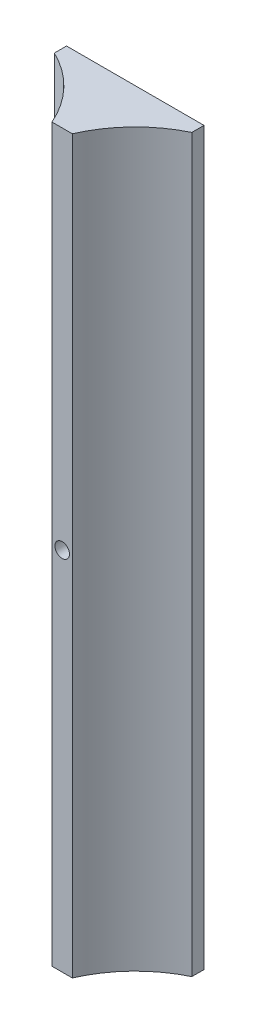
ISO-10303-21;
HEADER;
FILE_DESCRIPTION(('STEP AP214'),'2;1');
FILE_NAME('part.step','',(''),(''),'','','');
FILE_SCHEMA(('AUTOMOTIVE_DESIGN { 1 0 10303 214 1 1 1 1 }'));
ENDSEC;
DATA;
#1=APPLICATION_CONTEXT('core data for automotive mechanical design processes');
#2=APPLICATION_PROTOCOL_DEFINITION('international standard','automotive_design',2000,#1);
#3=PRODUCT_CONTEXT('',#1,'mechanical');
#4=PRODUCT('Part','Part','',(#3));
#5=PRODUCT_RELATED_PRODUCT_CATEGORY('part','',(#4));
#6=PRODUCT_DEFINITION_FORMATION('','',#4);
#7=PRODUCT_DEFINITION_CONTEXT('part definition',#1,'design');
#8=PRODUCT_DEFINITION('design','',#6,#7);
#9=PRODUCT_DEFINITION_SHAPE('','',#8);
#10=(LENGTH_UNIT() NAMED_UNIT(*) SI_UNIT(.MILLI.,.METRE.));
#11=(NAMED_UNIT(*) PLANE_ANGLE_UNIT() SI_UNIT($,.RADIAN.));
#12=(NAMED_UNIT(*) SI_UNIT($,.STERADIAN.) SOLID_ANGLE_UNIT());
#13=UNCERTAINTY_MEASURE_WITH_UNIT(LENGTH_MEASURE(1.E-05),#10,'distance_accuracy_value','');
#14=(GEOMETRIC_REPRESENTATION_CONTEXT(3) GLOBAL_UNCERTAINTY_ASSIGNED_CONTEXT((#13)) GLOBAL_UNIT_ASSIGNED_CONTEXT((#10,
#11,#12)) REPRESENTATION_CONTEXT('',''));
#15=CARTESIAN_POINT('',(0.,0.,0.));
#16=DIRECTION('',(0.,0.,1.));
#17=DIRECTION('',(1.,0.,0.));
#18=AXIS2_PLACEMENT_3D('',#15,#16,#17);
#19=CARTESIAN_POINT('',(-10.,60.,4.));
#20=DIRECTION('',(0.,-1.,0.));
#21=DIRECTION('',(0.,0.,-1.));
#22=AXIS2_PLACEMENT_3D('',#19,#20,#21);
#23=CYLINDRICAL_SURFACE('',#22,10.);
#24=CARTESIAN_POINT('',(-10.,0.,4.));
#25=DIRECTION('',(0.,-1.,0.));
#26=DIRECTION('',(0.,0.,-1.));
#27=AXIS2_PLACEMENT_3D('',#24,#25,#26);
#28=CIRCLE('',#27,10.);
#29=CARTESIAN_POINT('',(-5.64110105645933,0.,-5.));
#30=VERTEX_POINT('',#29);
#31=CARTESIAN_POINT('',(-0.83484861008832,0.,0.));
#32=VERTEX_POINT('',#31);
#33=EDGE_CURVE('E133',#30,#32,#28,.T.);
#34=ORIENTED_EDGE('',*,*,#33,.T.);
#35=DIRECTION('',(0.,-1.,0.));
#36=VECTOR('',#35,1.);
#37=CARTESIAN_POINT('',(-0.83484861008832,60.,0.));
#38=LINE('',#37,#36);
#39=CARTESIAN_POINT('',(-0.83484861008832,60.,0.));
#40=VERTEX_POINT('',#39);
#41=EDGE_CURVE('E11',#40,#32,#38,.T.);
#42=ORIENTED_EDGE('',*,*,#41,.F.);
#43=CARTESIAN_POINT('',(-10.,60.,4.));
#44=DIRECTION('',(0.,-1.,0.));
#45=DIRECTION('',(0.,0.,-1.));
#46=AXIS2_PLACEMENT_3D('',#43,#44,#45);
#47=CIRCLE('',#46,10.);
#48=CARTESIAN_POINT('',(-5.64110105645933,60.,-5.));
#49=VERTEX_POINT('',#48);
#50=EDGE_CURVE('E150',#49,#40,#47,.T.);
#51=ORIENTED_EDGE('',*,*,#50,.F.);
#52=DIRECTION('',(0.,-1.,0.));
#53=VECTOR('',#52,1.);
#54=CARTESIAN_POINT('',(-5.64110105645933,60.,-5.));
#55=LINE('',#54,#53);
#56=EDGE_CURVE('E129',#49,#30,#55,.T.);
#57=ORIENTED_EDGE('',*,*,#56,.T.);
#58=EDGE_LOOP('',(#34,#42,#51,#57));
#59=FACE_BOUND('',#58,.T.);
#60=ADVANCED_FACE('F43',(#59),#23,.F.);
#61=CARTESIAN_POINT('',(-0.83484861008832,60.,0.));
#62=DIRECTION('',(0.,0.,-1.));
#63=DIRECTION('',(-1.,0.,0.));
#64=AXIS2_PLACEMENT_3D('',#61,#62,#63);
#65=PLANE('',#64);
#66=CARTESIAN_POINT('',(0.,30.,0.));
#67=DIRECTION('',(0.,0.,-1.));
#68=DIRECTION('',(-1.,0.,0.));
#69=AXIS2_PLACEMENT_3D('',#66,#67,#68);
#70=CIRCLE('',#69,0.599999999999999);
#71=CARTESIAN_POINT('',(-0.599999999999999,30.,0.));
#72=VERTEX_POINT('',#71);
#73=EDGE_CURVE('E265',#72,#72,#70,.T.);
#74=ORIENTED_EDGE('',*,*,#73,.T.);
#75=EDGE_LOOP('',(#74));
#76=FACE_BOUND('',#75,.T.);
#77=DIRECTION('',(1.,0.,0.));
#78=VECTOR('',#77,1.);
#79=CARTESIAN_POINT('',(-0.83484861008832,0.,0.));
#80=LINE('',#79,#78);
#81=CARTESIAN_POINT('',(0.83484861008832,0.,0.));
#82=VERTEX_POINT('',#81);
#83=EDGE_CURVE('E137',#32,#82,#80,.T.);
#84=ORIENTED_EDGE('',*,*,#83,.T.);
#85=DIRECTION('',(0.,-1.,0.));
#86=VECTOR('',#85,1.);
#87=CARTESIAN_POINT('',(0.83484861008832,60.,0.));
#88=LINE('',#87,#86);
#89=CARTESIAN_POINT('',(0.83484861008832,60.,0.));
#90=VERTEX_POINT('',#89);
#91=EDGE_CURVE('E53',#90,#82,#88,.T.);
#92=ORIENTED_EDGE('',*,*,#91,.F.);
#93=DIRECTION('',(1.,0.,0.));
#94=VECTOR('',#93,1.);
#95=CARTESIAN_POINT('',(-0.83484861008832,60.,0.));
#96=LINE('',#95,#94);
#97=EDGE_CURVE('E98',#40,#90,#96,.T.);
#98=ORIENTED_EDGE('',*,*,#97,.F.);
#99=ORIENTED_EDGE('',*,*,#41,.T.);
#100=EDGE_LOOP('',(#84,#92,#98,#99));
#101=FACE_BOUND('',#100,.T.);
#102=ADVANCED_FACE('F180',(#76,#101),#65,.F.);
#103=CARTESIAN_POINT('',(10.,60.,4.));
#104=DIRECTION('',(0.,-1.,0.));
#105=DIRECTION('',(0.,0.,-1.));
#106=AXIS2_PLACEMENT_3D('',#103,#104,#105);
#107=CYLINDRICAL_SURFACE('',#106,10.);
#108=CARTESIAN_POINT('',(10.,0.,4.));
#109=DIRECTION('',(0.,-1.,0.));
#110=DIRECTION('',(0.,0.,-1.));
#111=AXIS2_PLACEMENT_3D('',#108,#109,#110);
#112=CIRCLE('',#111,10.);
#113=CARTESIAN_POINT('',(5.64110105645932,0.,-5.));
#114=VERTEX_POINT('',#113);
#115=EDGE_CURVE('E141',#82,#114,#112,.T.);
#116=ORIENTED_EDGE('',*,*,#115,.T.);
#117=DIRECTION('',(0.,-1.,0.));
#118=VECTOR('',#117,1.);
#119=CARTESIAN_POINT('',(5.64110105645932,60.,-5.));
#120=LINE('',#119,#118);
#121=CARTESIAN_POINT('',(5.64110105645932,60.,-5.));
#122=VERTEX_POINT('',#121);
#123=EDGE_CURVE('E122',#122,#114,#120,.T.);
#124=ORIENTED_EDGE('',*,*,#123,.F.);
#125=CARTESIAN_POINT('',(10.,60.,4.));
#126=DIRECTION('',(0.,-1.,0.));
#127=DIRECTION('',(0.,0.,-1.));
#128=AXIS2_PLACEMENT_3D('',#125,#126,#127);
#129=CIRCLE('',#128,10.);
#130=EDGE_CURVE('E111',#90,#122,#129,.T.);
#131=ORIENTED_EDGE('',*,*,#130,.F.);
#132=ORIENTED_EDGE('',*,*,#91,.T.);
#133=EDGE_LOOP('',(#116,#124,#131,#132));
#134=FACE_BOUND('',#133,.T.);
#135=ADVANCED_FACE('F161',(#134),#107,.F.);
#136=CARTESIAN_POINT('',(5.64110105645933,60.,-5.));
#137=DIRECTION('',(-1.,0.,0.));
#138=DIRECTION('',(0.,0.,1.));
#139=AXIS2_PLACEMENT_3D('',#136,#137,#138);
#140=PLANE('',#139);
#141=DIRECTION('',(0.,0.,-1.));
#142=VECTOR('',#141,1.);
#143=CARTESIAN_POINT('',(5.64110105645933,0.,-5.));
#144=LINE('',#143,#142);
#145=CARTESIAN_POINT('',(5.64110105645933,0.,-6.));
#146=VERTEX_POINT('',#145);
#147=EDGE_CURVE('E120',#114,#146,#144,.T.);
#148=ORIENTED_EDGE('',*,*,#147,.T.);
#149=DIRECTION('',(0.,-1.,0.));
#150=VECTOR('',#149,1.);
#151=CARTESIAN_POINT('',(5.64110105645933,60.,-6.));
#152=LINE('',#151,#150);
#153=CARTESIAN_POINT('',(5.64110105645933,60.,-6.));
#154=VERTEX_POINT('',#153);
#155=EDGE_CURVE('E117',#154,#146,#152,.T.);
#156=ORIENTED_EDGE('',*,*,#155,.F.);
#157=DIRECTION('',(0.,0.,-1.));
#158=VECTOR('',#157,1.);
#159=CARTESIAN_POINT('',(5.64110105645933,60.,-5.));
#160=LINE('',#159,#158);
#161=EDGE_CURVE('E105',#122,#154,#160,.T.);
#162=ORIENTED_EDGE('',*,*,#161,.F.);
#163=ORIENTED_EDGE('',*,*,#123,.T.);
#164=EDGE_LOOP('',(#148,#156,#162,#163));
#165=FACE_BOUND('',#164,.T.);
#166=ADVANCED_FACE('F118',(#165),#140,.F.);
#167=CARTESIAN_POINT('',(5.64110105645933,60.,-6.));
#168=DIRECTION('',(0.,0.,1.));
#169=DIRECTION('',(1.,0.,0.));
#170=AXIS2_PLACEMENT_3D('',#167,#168,#169);
#171=PLANE('',#170);
#172=CARTESIAN_POINT('',(0.,30.,-6.));
#173=DIRECTION('',(0.,0.,-1.));
#174=DIRECTION('',(-1.,0.,0.));
#175=AXIS2_PLACEMENT_3D('',#172,#173,#174);
#176=CIRCLE('',#175,1.27499999999999);
#177=CARTESIAN_POINT('',(-1.27499999999999,30.,-6.));
#178=VERTEX_POINT('',#177);
#179=EDGE_CURVE('E267',#178,#178,#176,.T.);
#180=ORIENTED_EDGE('',*,*,#179,.F.);
#181=EDGE_LOOP('',(#180));
#182=FACE_BOUND('',#181,.T.);
#183=DIRECTION('',(-1.,0.,0.));
#184=VECTOR('',#183,1.);
#185=CARTESIAN_POINT('',(5.64110105645933,0.,-6.));
#186=LINE('',#185,#184);
#187=CARTESIAN_POINT('',(-5.64110105645933,0.,-6.));
#188=VERTEX_POINT('',#187);
#189=EDGE_CURVE('E84',#146,#188,#186,.T.);
#190=ORIENTED_EDGE('',*,*,#189,.T.);
#191=DIRECTION('',(0.,-1.,0.));
#192=VECTOR('',#191,1.);
#193=CARTESIAN_POINT('',(-5.64110105645933,60.,-6.));
#194=LINE('',#193,#192);
#195=CARTESIAN_POINT('',(-5.64110105645933,60.,-6.));
#196=VERTEX_POINT('',#195);
#197=EDGE_CURVE('E123',#196,#188,#194,.T.);
#198=ORIENTED_EDGE('',*,*,#197,.F.);
#199=DIRECTION('',(-1.,0.,0.));
#200=VECTOR('',#199,1.);
#201=CARTESIAN_POINT('',(5.64110105645933,60.,-6.));
#202=LINE('',#201,#200);
#203=EDGE_CURVE('E109',#154,#196,#202,.T.);
#204=ORIENTED_EDGE('',*,*,#203,.F.);
#205=ORIENTED_EDGE('',*,*,#155,.T.);
#206=EDGE_LOOP('',(#190,#198,#204,#205));
#207=FACE_BOUND('',#206,.T.);
#208=ADVANCED_FACE('F125',(#182,#207),#171,.F.);
#209=CARTESIAN_POINT('',(-5.64110105645933,60.,-6.));
#210=DIRECTION('',(1.,0.,0.));
#211=DIRECTION('',(0.,0.,-1.));
#212=AXIS2_PLACEMENT_3D('',#209,#210,#211);
#213=PLANE('',#212);
#214=DIRECTION('',(0.,0.,1.));
#215=VECTOR('',#214,1.);
#216=CARTESIAN_POINT('',(-5.64110105645933,0.,-6.));
#217=LINE('',#216,#215);
#218=EDGE_CURVE('E90',#188,#30,#217,.T.);
#219=ORIENTED_EDGE('',*,*,#218,.T.);
#220=ORIENTED_EDGE('',*,*,#56,.F.);
#221=DIRECTION('',(0.,0.,1.));
#222=VECTOR('',#221,1.);
#223=CARTESIAN_POINT('',(-5.64110105645933,60.,-6.));
#224=LINE('',#223,#222);
#225=EDGE_CURVE('E61',#196,#49,#224,.T.);
#226=ORIENTED_EDGE('',*,*,#225,.F.);
#227=ORIENTED_EDGE('',*,*,#197,.T.);
#228=EDGE_LOOP('',(#219,#220,#226,#227));
#229=FACE_BOUND('',#228,.T.);
#230=ADVANCED_FACE('F168',(#229),#213,.F.);
#231=CARTESIAN_POINT('',(-10.,60.,4.));
#232=DIRECTION('',(0.,-1.,0.));
#233=DIRECTION('',(0.,0.,-1.));
#234=AXIS2_PLACEMENT_3D('',#231,#232,#233);
#235=PLANE('',#234);
#236=ORIENTED_EDGE('',*,*,#50,.T.);
#237=ORIENTED_EDGE('',*,*,#97,.T.);
#238=ORIENTED_EDGE('',*,*,#130,.T.);
#239=ORIENTED_EDGE('',*,*,#161,.T.);
#240=ORIENTED_EDGE('',*,*,#203,.T.);
#241=ORIENTED_EDGE('',*,*,#225,.T.);
#242=EDGE_LOOP('',(#236,#237,#238,#239,#240,#241));
#243=FACE_BOUND('',#242,.T.);
#244=ADVANCED_FACE('F107',(#243),#235,.F.);
#245=CARTESIAN_POINT('',(-10.,0.,4.));
#246=DIRECTION('',(0.,-1.,0.));
#247=DIRECTION('',(0.,0.,-1.));
#248=AXIS2_PLACEMENT_3D('',#245,#246,#247);
#249=PLANE('',#248);
#250=ORIENTED_EDGE('',*,*,#33,.F.);
#251=ORIENTED_EDGE('',*,*,#218,.F.);
#252=ORIENTED_EDGE('',*,*,#189,.F.);
#253=ORIENTED_EDGE('',*,*,#147,.F.);
#254=ORIENTED_EDGE('',*,*,#115,.F.);
#255=ORIENTED_EDGE('',*,*,#83,.F.);
#256=EDGE_LOOP('',(#250,#251,#252,#253,#254,#255));
#257=FACE_BOUND('',#256,.T.);
#258=ADVANCED_FACE('F164',(#257),#249,.T.);
#259=CARTESIAN_POINT('',(0.,30.,-2.));
#260=DIRECTION('',(0.,0.,-1.));
#261=DIRECTION('',(-1.,0.,0.));
#262=AXIS2_PLACEMENT_3D('',#259,#260,#261);
#263=CONICAL_SURFACE('',#262,1.275,1.02974425867665);
#264=CARTESIAN_POINT('',(0.,30.,-1.5944190821564));
#265=DIRECTION('',(0.,0.,-1.));
#266=DIRECTION('',(-1.,0.,0.));
#267=AXIS2_PLACEMENT_3D('',#264,#265,#266);
#268=CIRCLE('',#267,0.599999999999999);
#269=CARTESIAN_POINT('',(-0.599999999999999,30.,-1.5944190821564));
#270=VERTEX_POINT('',#269);
#271=EDGE_CURVE('E46',#270,#270,#268,.F.);
#272=ORIENTED_EDGE('',*,*,#271,.T.);
#273=EDGE_LOOP('',(#272));
#274=FACE_BOUND('',#273,.T.);
#275=CARTESIAN_POINT('',(0.,30.,-2.));
#276=DIRECTION('',(0.,0.,-1.));
#277=DIRECTION('',(-1.,0.,0.));
#278=AXIS2_PLACEMENT_3D('',#275,#276,#277);
#279=CIRCLE('',#278,1.275);
#280=CARTESIAN_POINT('',(-1.275,30.,-2.));
#281=VERTEX_POINT('',#280);
#282=EDGE_CURVE('E138',#281,#281,#279,.T.);
#283=ORIENTED_EDGE('',*,*,#282,.T.);
#284=EDGE_LOOP('',(#283));
#285=FACE_BOUND('',#284,.T.);
#286=ADVANCED_FACE('F217',(#274,#285),#263,.F.);
#287=CARTESIAN_POINT('',(0.,30.,-6.));
#288=DIRECTION('',(0.,0.,-1.));
#289=DIRECTION('',(-1.,0.,0.));
#290=AXIS2_PLACEMENT_3D('',#287,#288,#289);
#291=CYLINDRICAL_SURFACE('',#290,1.27499999999999);
#292=ORIENTED_EDGE('',*,*,#282,.F.);
#293=EDGE_LOOP('',(#292));
#294=FACE_BOUND('',#293,.T.);
#295=ORIENTED_EDGE('',*,*,#179,.T.);
#296=EDGE_LOOP('',(#295));
#297=FACE_BOUND('',#296,.T.);
#298=ADVANCED_FACE('F211',(#294,#297),#291,.F.);
#299=CARTESIAN_POINT('',(0.,30.,-6.));
#300=DIRECTION('',(0.,0.,-1.));
#301=DIRECTION('',(-1.,0.,0.));
#302=AXIS2_PLACEMENT_3D('',#299,#300,#301);
#303=CYLINDRICAL_SURFACE('',#302,0.599999999999999);
#304=ORIENTED_EDGE('',*,*,#271,.F.);
#305=EDGE_LOOP('',(#304));
#306=FACE_BOUND('',#305,.T.);
#307=ORIENTED_EDGE('',*,*,#73,.F.);
#308=EDGE_LOOP('',(#307));
#309=FACE_BOUND('',#308,.T.);
#310=ADVANCED_FACE('F216',(#306,#309),#303,.F.);
#311=CLOSED_SHELL('',(#60,#102,#135,#166,#208,#230,#244,#258,#286,#298,#310));
#312=MANIFOLD_SOLID_BREP('B2',#311);
#313=ADVANCED_BREP_SHAPE_REPRESENTATION('',(#18,#312),#14);
#314=SHAPE_DEFINITION_REPRESENTATION(#9,#313);
ENDSEC;
END-ISO-10303-21;
